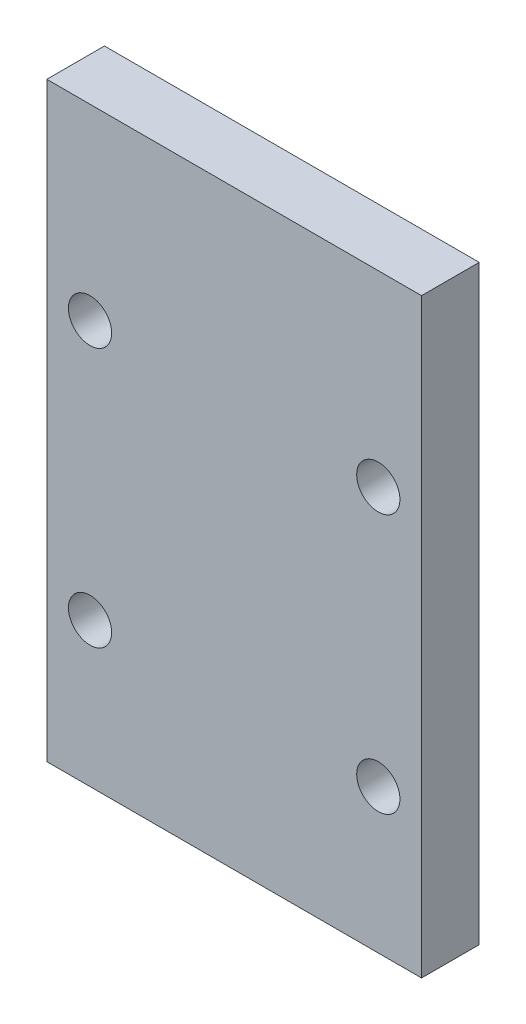
ISO-10303-21;
HEADER;
FILE_DESCRIPTION(('STEP AP214'),'2;1');
FILE_NAME('part.step','',(''),(''),'','','');
FILE_SCHEMA(('AUTOMOTIVE_DESIGN { 1 0 10303 214 1 1 1 1 }'));
ENDSEC;
DATA;
#1=APPLICATION_CONTEXT('core data for automotive mechanical design processes');
#2=APPLICATION_PROTOCOL_DEFINITION('international standard','automotive_design',2000,#1);
#3=PRODUCT_CONTEXT('',#1,'mechanical');
#4=PRODUCT('Part','Part','',(#3));
#5=PRODUCT_RELATED_PRODUCT_CATEGORY('part','',(#4));
#6=PRODUCT_DEFINITION_FORMATION('','',#4);
#7=PRODUCT_DEFINITION_CONTEXT('part definition',#1,'design');
#8=PRODUCT_DEFINITION('design','',#6,#7);
#9=PRODUCT_DEFINITION_SHAPE('','',#8);
#10=(LENGTH_UNIT() NAMED_UNIT(*) SI_UNIT(.MILLI.,.METRE.));
#11=(NAMED_UNIT(*) PLANE_ANGLE_UNIT() SI_UNIT($,.RADIAN.));
#12=(NAMED_UNIT(*) SI_UNIT($,.STERADIAN.) SOLID_ANGLE_UNIT());
#13=UNCERTAINTY_MEASURE_WITH_UNIT(LENGTH_MEASURE(1.E-05),#10,'distance_accuracy_value','');
#14=(GEOMETRIC_REPRESENTATION_CONTEXT(3) GLOBAL_UNCERTAINTY_ASSIGNED_CONTEXT((#13)) GLOBAL_UNIT_ASSIGNED_CONTEXT((#10,
#11,#12)) REPRESENTATION_CONTEXT('',''));
#15=CARTESIAN_POINT('',(0.,0.,0.));
#16=DIRECTION('',(0.,0.,1.));
#17=DIRECTION('',(1.,0.,0.));
#18=AXIS2_PLACEMENT_3D('',#15,#16,#17);
#19=CARTESIAN_POINT('',(0.,0.,4.));
#20=DIRECTION('',(0.,0.,-1.));
#21=DIRECTION('',(-1.,0.,0.));
#22=AXIS2_PLACEMENT_3D('',#19,#20,#21);
#23=PLANE('',#22);
#24=DIRECTION('',(1.,0.,0.));
#25=VECTOR('',#24,1.);
#26=CARTESIAN_POINT('',(26.,0.,4.));
#27=LINE('',#26,#25);
#28=CARTESIAN_POINT('',(0.,0.,4.));
#29=VERTEX_POINT('',#28);
#30=CARTESIAN_POINT('',(26.,0.,4.));
#31=VERTEX_POINT('',#30);
#32=EDGE_CURVE('E89',#29,#31,#27,.T.);
#33=ORIENTED_EDGE('',*,*,#32,.T.);
#34=DIRECTION('',(0.,1.,0.));
#35=VECTOR('',#34,1.);
#36=CARTESIAN_POINT('',(26.,41.,4.));
#37=LINE('',#36,#35);
#38=CARTESIAN_POINT('',(26.,41.,4.));
#39=VERTEX_POINT('',#38);
#40=EDGE_CURVE('E84',#31,#39,#37,.T.);
#41=ORIENTED_EDGE('',*,*,#40,.T.);
#42=DIRECTION('',(-1.,0.,0.));
#43=VECTOR('',#42,1.);
#44=CARTESIAN_POINT('',(0.,41.,4.));
#45=LINE('',#44,#43);
#46=CARTESIAN_POINT('',(0.,41.,4.));
#47=VERTEX_POINT('',#46);
#48=EDGE_CURVE('E87',#39,#47,#45,.T.);
#49=ORIENTED_EDGE('',*,*,#48,.T.);
#50=DIRECTION('',(0.,-1.,0.));
#51=VECTOR('',#50,1.);
#52=CARTESIAN_POINT('',(0.,0.,4.));
#53=LINE('',#52,#51);
#54=EDGE_CURVE('E54',#47,#29,#53,.T.);
#55=ORIENTED_EDGE('',*,*,#54,.T.);
#56=EDGE_LOOP('',(#33,#41,#49,#55));
#57=FACE_BOUND('',#56,.T.);
#58=CARTESIAN_POINT('',(3.00000000000001,28.,4.));
#59=DIRECTION('',(0.,0.,1.));
#60=DIRECTION('',(1.,0.,0.));
#61=AXIS2_PLACEMENT_3D('',#58,#59,#60);
#62=CIRCLE('',#61,1.5);
#63=CARTESIAN_POINT('',(4.50000000000001,28.,4.));
#64=VERTEX_POINT('',#63);
#65=EDGE_CURVE('E104',#64,#64,#62,.T.);
#66=ORIENTED_EDGE('',*,*,#65,.F.);
#67=EDGE_LOOP('',(#66));
#68=FACE_BOUND('',#67,.T.);
#69=CARTESIAN_POINT('',(3.00000000000001,10.,4.));
#70=DIRECTION('',(0.,0.,1.));
#71=DIRECTION('',(1.,0.,0.));
#72=AXIS2_PLACEMENT_3D('',#69,#70,#71);
#73=CIRCLE('',#72,1.5);
#74=CARTESIAN_POINT('',(4.50000000000001,10.,4.));
#75=VERTEX_POINT('',#74);
#76=EDGE_CURVE('E119',#75,#75,#73,.T.);
#77=ORIENTED_EDGE('',*,*,#76,.F.);
#78=EDGE_LOOP('',(#77));
#79=FACE_BOUND('',#78,.T.);
#80=CARTESIAN_POINT('',(23.,10.,4.));
#81=DIRECTION('',(0.,0.,1.));
#82=DIRECTION('',(-1.,0.,0.));
#83=AXIS2_PLACEMENT_3D('',#80,#81,#82);
#84=CIRCLE('',#83,1.5);
#85=CARTESIAN_POINT('',(21.5,10.,4.));
#86=VERTEX_POINT('',#85);
#87=EDGE_CURVE('E125',#86,#86,#84,.T.);
#88=ORIENTED_EDGE('',*,*,#87,.F.);
#89=EDGE_LOOP('',(#88));
#90=FACE_BOUND('',#89,.T.);
#91=CARTESIAN_POINT('',(23.,28.,4.));
#92=DIRECTION('',(0.,0.,1.));
#93=DIRECTION('',(-1.,0.,0.));
#94=AXIS2_PLACEMENT_3D('',#91,#92,#93);
#95=CIRCLE('',#94,1.5);
#96=CARTESIAN_POINT('',(21.5,28.,4.));
#97=VERTEX_POINT('',#96);
#98=EDGE_CURVE('E131',#97,#97,#95,.T.);
#99=ORIENTED_EDGE('',*,*,#98,.F.);
#100=EDGE_LOOP('',(#99));
#101=FACE_BOUND('',#100,.T.);
#102=ADVANCED_FACE('F37',(#57,#68,#79,#90,#101),#23,.F.);
#103=CARTESIAN_POINT('',(0.,0.,0.));
#104=DIRECTION('',(0.,0.,-1.));
#105=DIRECTION('',(-1.,0.,0.));
#106=AXIS2_PLACEMENT_3D('',#103,#104,#105);
#107=PLANE('',#106);
#108=CARTESIAN_POINT('',(23.,10.,0.));
#109=DIRECTION('',(0.,0.,1.));
#110=DIRECTION('',(-1.,0.,0.));
#111=AXIS2_PLACEMENT_3D('',#108,#109,#110);
#112=CIRCLE('',#111,1.5);
#113=CARTESIAN_POINT('',(21.5,10.,0.));
#114=VERTEX_POINT('',#113);
#115=EDGE_CURVE('E128',#114,#114,#112,.T.);
#116=ORIENTED_EDGE('',*,*,#115,.T.);
#117=EDGE_LOOP('',(#116));
#118=FACE_BOUND('',#117,.T.);
#119=CARTESIAN_POINT('',(3.00000000000001,28.,0.));
#120=DIRECTION('',(0.,0.,1.));
#121=DIRECTION('',(1.,0.,0.));
#122=AXIS2_PLACEMENT_3D('',#119,#120,#121);
#123=CIRCLE('',#122,1.5);
#124=CARTESIAN_POINT('',(4.50000000000001,28.,0.));
#125=VERTEX_POINT('',#124);
#126=EDGE_CURVE('E116',#125,#125,#123,.T.);
#127=ORIENTED_EDGE('',*,*,#126,.T.);
#128=EDGE_LOOP('',(#127));
#129=FACE_BOUND('',#128,.T.);
#130=DIRECTION('',(1.,0.,0.));
#131=VECTOR('',#130,1.);
#132=CARTESIAN_POINT('',(26.,0.,0.));
#133=LINE('',#132,#131);
#134=CARTESIAN_POINT('',(0.,0.,0.));
#135=VERTEX_POINT('',#134);
#136=CARTESIAN_POINT('',(26.,0.,0.));
#137=VERTEX_POINT('',#136);
#138=EDGE_CURVE('E101',#135,#137,#133,.T.);
#139=ORIENTED_EDGE('',*,*,#138,.F.);
#140=DIRECTION('',(0.,-1.,0.));
#141=VECTOR('',#140,1.);
#142=CARTESIAN_POINT('',(0.,0.,0.));
#143=LINE('',#142,#141);
#144=CARTESIAN_POINT('',(0.,41.,0.));
#145=VERTEX_POINT('',#144);
#146=EDGE_CURVE('E77',#145,#135,#143,.T.);
#147=ORIENTED_EDGE('',*,*,#146,.F.);
#148=DIRECTION('',(-1.,0.,0.));
#149=VECTOR('',#148,1.);
#150=CARTESIAN_POINT('',(0.,41.,0.));
#151=LINE('',#150,#149);
#152=CARTESIAN_POINT('',(26.,41.,0.));
#153=VERTEX_POINT('',#152);
#154=EDGE_CURVE('E71',#153,#145,#151,.T.);
#155=ORIENTED_EDGE('',*,*,#154,.F.);
#156=DIRECTION('',(0.,1.,0.));
#157=VECTOR('',#156,1.);
#158=CARTESIAN_POINT('',(26.,41.,0.));
#159=LINE('',#158,#157);
#160=EDGE_CURVE('E93',#137,#153,#159,.T.);
#161=ORIENTED_EDGE('',*,*,#160,.F.);
#162=EDGE_LOOP('',(#139,#147,#155,#161));
#163=FACE_BOUND('',#162,.T.);
#164=CARTESIAN_POINT('',(3.00000000000001,10.,0.));
#165=DIRECTION('',(0.,0.,1.));
#166=DIRECTION('',(1.,0.,0.));
#167=AXIS2_PLACEMENT_3D('',#164,#165,#166);
#168=CIRCLE('',#167,1.5);
#169=CARTESIAN_POINT('',(4.50000000000001,10.,0.));
#170=VERTEX_POINT('',#169);
#171=EDGE_CURVE('E122',#170,#170,#168,.T.);
#172=ORIENTED_EDGE('',*,*,#171,.T.);
#173=EDGE_LOOP('',(#172));
#174=FACE_BOUND('',#173,.T.);
#175=CARTESIAN_POINT('',(23.,28.,0.));
#176=DIRECTION('',(0.,0.,1.));
#177=DIRECTION('',(-1.,0.,0.));
#178=AXIS2_PLACEMENT_3D('',#175,#176,#177);
#179=CIRCLE('',#178,1.5);
#180=CARTESIAN_POINT('',(21.5,28.,0.));
#181=VERTEX_POINT('',#180);
#182=EDGE_CURVE('E134',#181,#181,#179,.T.);
#183=ORIENTED_EDGE('',*,*,#182,.T.);
#184=EDGE_LOOP('',(#183));
#185=FACE_BOUND('',#184,.T.);
#186=ADVANCED_FACE('F112',(#118,#129,#163,#174,#185),#107,.T.);
#187=CARTESIAN_POINT('',(26.,0.,4.));
#188=DIRECTION('',(0.,1.,0.));
#189=DIRECTION('',(-1.,0.,0.));
#190=AXIS2_PLACEMENT_3D('',#187,#188,#189);
#191=PLANE('',#190);
#192=ORIENTED_EDGE('',*,*,#138,.T.);
#193=DIRECTION('',(0.,0.,-1.));
#194=VECTOR('',#193,1.);
#195=CARTESIAN_POINT('',(26.,0.,4.));
#196=LINE('',#195,#194);
#197=EDGE_CURVE('E11',#31,#137,#196,.T.);
#198=ORIENTED_EDGE('',*,*,#197,.F.);
#199=ORIENTED_EDGE('',*,*,#32,.F.);
#200=DIRECTION('',(0.,0.,-1.));
#201=VECTOR('',#200,1.);
#202=CARTESIAN_POINT('',(0.,0.,4.));
#203=LINE('',#202,#201);
#204=EDGE_CURVE('E97',#29,#135,#203,.T.);
#205=ORIENTED_EDGE('',*,*,#204,.T.);
#206=EDGE_LOOP('',(#192,#198,#199,#205));
#207=FACE_BOUND('',#206,.T.);
#208=ADVANCED_FACE('F39',(#207),#191,.F.);
#209=CARTESIAN_POINT('',(26.,41.,4.));
#210=DIRECTION('',(-1.,0.,0.));
#211=DIRECTION('',(0.,-1.,0.));
#212=AXIS2_PLACEMENT_3D('',#209,#210,#211);
#213=PLANE('',#212);
#214=ORIENTED_EDGE('',*,*,#160,.T.);
#215=DIRECTION('',(0.,0.,-1.));
#216=VECTOR('',#215,1.);
#217=CARTESIAN_POINT('',(26.,41.,4.));
#218=LINE('',#217,#216);
#219=EDGE_CURVE('E46',#39,#153,#218,.T.);
#220=ORIENTED_EDGE('',*,*,#219,.F.);
#221=ORIENTED_EDGE('',*,*,#40,.F.);
#222=ORIENTED_EDGE('',*,*,#197,.T.);
#223=EDGE_LOOP('',(#214,#220,#221,#222));
#224=FACE_BOUND('',#223,.T.);
#225=ADVANCED_FACE('F92',(#224),#213,.F.);
#226=CARTESIAN_POINT('',(0.,41.,4.));
#227=DIRECTION('',(0.,-1.,0.));
#228=DIRECTION('',(0.,0.,-1.));
#229=AXIS2_PLACEMENT_3D('',#226,#227,#228);
#230=PLANE('',#229);
#231=ORIENTED_EDGE('',*,*,#154,.T.);
#232=DIRECTION('',(0.,0.,-1.));
#233=VECTOR('',#232,1.);
#234=CARTESIAN_POINT('',(0.,41.,4.));
#235=LINE('',#234,#233);
#236=EDGE_CURVE('E94',#47,#145,#235,.T.);
#237=ORIENTED_EDGE('',*,*,#236,.F.);
#238=ORIENTED_EDGE('',*,*,#48,.F.);
#239=ORIENTED_EDGE('',*,*,#219,.T.);
#240=EDGE_LOOP('',(#231,#237,#238,#239));
#241=FACE_BOUND('',#240,.T.);
#242=ADVANCED_FACE('F95',(#241),#230,.F.);
#243=CARTESIAN_POINT('',(0.,0.,4.));
#244=DIRECTION('',(1.,0.,0.));
#245=DIRECTION('',(0.,0.,-1.));
#246=AXIS2_PLACEMENT_3D('',#243,#244,#245);
#247=PLANE('',#246);
#248=ORIENTED_EDGE('',*,*,#146,.T.);
#249=ORIENTED_EDGE('',*,*,#204,.F.);
#250=ORIENTED_EDGE('',*,*,#54,.F.);
#251=ORIENTED_EDGE('',*,*,#236,.T.);
#252=EDGE_LOOP('',(#248,#249,#250,#251));
#253=FACE_BOUND('',#252,.T.);
#254=ADVANCED_FACE('F109',(#253),#247,.F.);
#255=CARTESIAN_POINT('',(3.00000000000001,28.,4.));
#256=DIRECTION('',(0.,0.,-1.));
#257=DIRECTION('',(-1.,0.,0.));
#258=AXIS2_PLACEMENT_3D('',#255,#256,#257);
#259=CYLINDRICAL_SURFACE('',#258,1.5);
#260=ORIENTED_EDGE('',*,*,#65,.T.);
#261=EDGE_LOOP('',(#260));
#262=FACE_BOUND('',#261,.T.);
#263=ORIENTED_EDGE('',*,*,#126,.F.);
#264=EDGE_LOOP('',(#263));
#265=FACE_BOUND('',#264,.T.);
#266=ADVANCED_FACE('F151',(#262,#265),#259,.F.);
#267=CARTESIAN_POINT('',(3.00000000000001,10.,4.));
#268=DIRECTION('',(0.,0.,-1.));
#269=DIRECTION('',(-1.,0.,0.));
#270=AXIS2_PLACEMENT_3D('',#267,#268,#269);
#271=CYLINDRICAL_SURFACE('',#270,1.5);
#272=ORIENTED_EDGE('',*,*,#76,.T.);
#273=EDGE_LOOP('',(#272));
#274=FACE_BOUND('',#273,.T.);
#275=ORIENTED_EDGE('',*,*,#171,.F.);
#276=EDGE_LOOP('',(#275));
#277=FACE_BOUND('',#276,.T.);
#278=ADVANCED_FACE('F197',(#274,#277),#271,.F.);
#279=CARTESIAN_POINT('',(23.,10.,4.));
#280=DIRECTION('',(0.,0.,-1.));
#281=DIRECTION('',(-1.,0.,0.));
#282=AXIS2_PLACEMENT_3D('',#279,#280,#281);
#283=CYLINDRICAL_SURFACE('',#282,1.5);
#284=ORIENTED_EDGE('',*,*,#87,.T.);
#285=EDGE_LOOP('',(#284));
#286=FACE_BOUND('',#285,.T.);
#287=ORIENTED_EDGE('',*,*,#115,.F.);
#288=EDGE_LOOP('',(#287));
#289=FACE_BOUND('',#288,.T.);
#290=ADVANCED_FACE('F205',(#286,#289),#283,.F.);
#291=CARTESIAN_POINT('',(23.,28.,4.));
#292=DIRECTION('',(0.,0.,-1.));
#293=DIRECTION('',(-1.,0.,0.));
#294=AXIS2_PLACEMENT_3D('',#291,#292,#293);
#295=CYLINDRICAL_SURFACE('',#294,1.5);
#296=ORIENTED_EDGE('',*,*,#98,.T.);
#297=EDGE_LOOP('',(#296));
#298=FACE_BOUND('',#297,.T.);
#299=ORIENTED_EDGE('',*,*,#182,.F.);
#300=EDGE_LOOP('',(#299));
#301=FACE_BOUND('',#300,.T.);
#302=ADVANCED_FACE('F140',(#298,#301),#295,.F.);
#303=CLOSED_SHELL('',(#102,#186,#208,#225,#242,#254,#266,#278,#290,#302));
#304=MANIFOLD_SOLID_BREP('B2',#303);
#305=ADVANCED_BREP_SHAPE_REPRESENTATION('',(#18,#304),#14);
#306=SHAPE_DEFINITION_REPRESENTATION(#9,#305);
ENDSEC;
END-ISO-10303-21;
